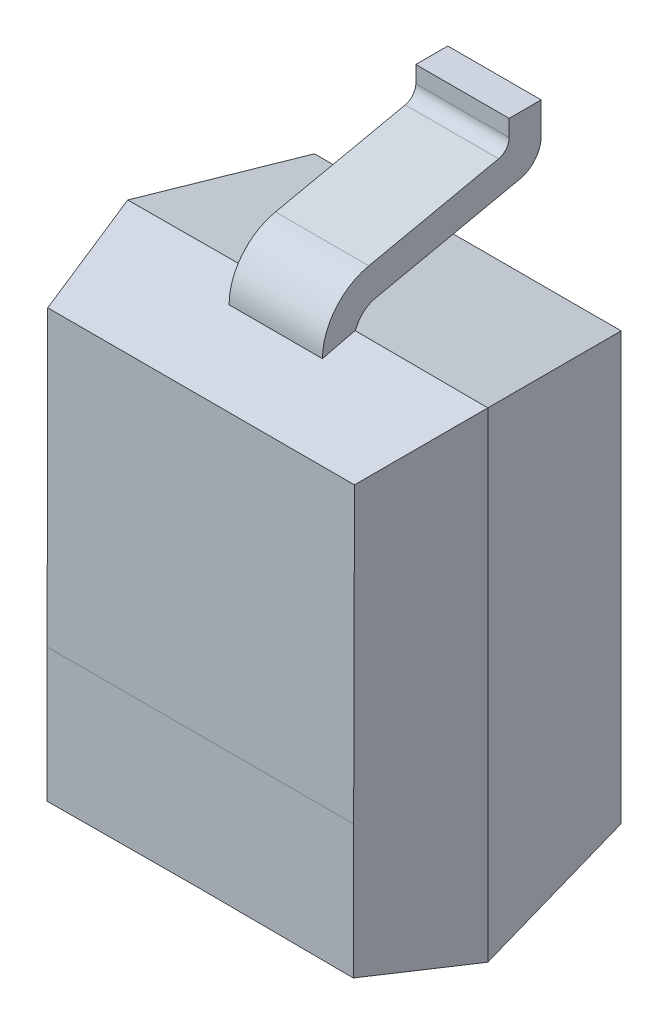
ISO-10303-21;
HEADER;
FILE_DESCRIPTION(('STEP AP214'),'2;1');
FILE_NAME('part.step','',(''),(''),'','','');
FILE_SCHEMA(('AUTOMOTIVE_DESIGN { 1 0 10303 214 1 1 1 1 }'));
ENDSEC;
DATA;
#1=APPLICATION_CONTEXT('core data for automotive mechanical design processes');
#2=APPLICATION_PROTOCOL_DEFINITION('international standard','automotive_design',2000,#1);
#3=PRODUCT_CONTEXT('',#1,'mechanical');
#4=PRODUCT('Part','Part','',(#3));
#5=PRODUCT_RELATED_PRODUCT_CATEGORY('part','',(#4));
#6=PRODUCT_DEFINITION_FORMATION('','',#4);
#7=PRODUCT_DEFINITION_CONTEXT('part definition',#1,'design');
#8=PRODUCT_DEFINITION('design','',#6,#7);
#9=PRODUCT_DEFINITION_SHAPE('','',#8);
#10=(LENGTH_UNIT() NAMED_UNIT(*) SI_UNIT(.MILLI.,.METRE.));
#11=(NAMED_UNIT(*) PLANE_ANGLE_UNIT() SI_UNIT($,.RADIAN.));
#12=(NAMED_UNIT(*) SI_UNIT($,.STERADIAN.) SOLID_ANGLE_UNIT());
#13=UNCERTAINTY_MEASURE_WITH_UNIT(LENGTH_MEASURE(1.E-05),#10,'distance_accuracy_value','');
#14=(GEOMETRIC_REPRESENTATION_CONTEXT(3) GLOBAL_UNCERTAINTY_ASSIGNED_CONTEXT((#13)) GLOBAL_UNIT_ASSIGNED_CONTEXT((#10,
#11,#12)) REPRESENTATION_CONTEXT('',''));
#15=CARTESIAN_POINT('',(0.,0.,0.));
#16=DIRECTION('',(0.,0.,1.));
#17=DIRECTION('',(1.,0.,0.));
#18=AXIS2_PLACEMENT_3D('',#15,#16,#17);
#19=CARTESIAN_POINT('',(59.103070808578,39.973934917196,0.6));
#20=DIRECTION('',(-1.,-4.371138828674E-08,0.));
#21=DIRECTION('',(0.,0.,1.));
#22=AXIS2_PLACEMENT_3D('',#19,#20,#21);
#23=CYLINDRICAL_SURFACE('',#22,0.09999999999807);
#24=CARTESIAN_POINT('',(59.103070812852,39.876154675796,0.620952908900103));
#25=DIRECTION('',(-0.999999999999999,-4.37114035443748E-08,0.));
#26=VECTOR('',#25,1.);
#27=LINE('',#24,#26);
#28=CARTESIAN_POINT('',(59.1030708128521,39.8761546759612,0.620952908860479));
#29=VERTEX_POINT('',#28);
#30=CARTESIAN_POINT('',(58.7530708128521,39.8761546606619,0.620952908859088));
#31=VERTEX_POINT('',#30);
#32=EDGE_CURVE('E1406',#29,#31,#27,.T.);
#33=ORIENTED_EDGE('',*,*,#32,.T.);
#34=CARTESIAN_POINT('',(58.7530708099094,39.943479005155,0.697685905259001));
#35=CARTESIAN_POINT('',(58.7530708109946,39.9186531098244,0.688033267951233));
#36=CARTESIAN_POINT('',(58.7530708118032,39.9001542227361,0.667374738457376));
#37=CARTESIAN_POINT('',(58.7530708126106,39.881681669388,0.646745617021661));
#38=CARTESIAN_POINT('',(58.7530708128522,39.876154660495,0.620952908892001));
#39=B_SPLINE_CURVE_WITH_KNOTS('',2,(#34,#35,#36,#37,#38),.UNSPECIFIED.,.F.,.F.,(3,2,3),(0.,0.5,
1.),.UNSPECIFIED.);
#40=CARTESIAN_POINT('',(58.7530708099084,39.9434920738784,0.697517092070688));
#41=VERTEX_POINT('',#40);
#42=EDGE_CURVE('E1246',#41,#31,#39,.T.);
#43=ORIENTED_EDGE('',*,*,#42,.F.);
#44=CARTESIAN_POINT('',(59.1030708098921,39.9438647031394,0.695371810407155));
#45=DIRECTION('',(-0.999999999999999,-4.37113837189628E-08,0.));
#46=VECTOR('',#45,1.);
#47=LINE('',#44,#46);
#48=CARTESIAN_POINT('',(59.1030708099085,39.9434920891776,0.697517092070596));
#49=VERTEX_POINT('',#48);
#50=EDGE_CURVE('E1010',#49,#41,#47,.T.);
#51=ORIENTED_EDGE('',*,*,#50,.F.);
#52=CARTESIAN_POINT('',(59.1030708085777,39.973934917196,0.6));
#53=DIRECTION('',(1.,4.371138828674E-08,0.));
#54=DIRECTION('',(1.30104260700772E-08,-0.29764324009944,0.954677171416132));
#55=AXIS2_PLACEMENT_3D('',#52,#53,#54);
#56=CIRCLE('',#55,0.09999999999807);
#57=EDGE_CURVE('E1357',#49,#29,#56,.T.);
#58=ORIENTED_EDGE('',*,*,#57,.T.);
#59=EDGE_LOOP('',(#33,#43,#51,#58));
#60=FACE_BOUND('',#59,.T.);
#61=ADVANCED_FACE('F18',(#60),#23,.F.);
#62=CARTESIAN_POINT('',(58.928070816558,39.791386013957,0.225365853517));
#63=DIRECTION('',(4.27411009897561E-08,-0.977802414084682,0.209529088696932));
#64=DIRECTION('',(-1.,-4.37113882867286E-08,0.));
#65=AXIS2_PLACEMENT_3D('',#62,#63,#64);
#66=PLANE('',#65);
#67=CARTESIAN_POINT('',(58.753070817928,39.760031984897,0.0790470911300936));
#68=DIRECTION('',(0.999999999999999,4.37113837189636E-08,0.));
#69=VECTOR('',#68,1.);
#70=LINE('',#67,#69);
#71=CARTESIAN_POINT('',(58.753070817928,39.7600319852406,0.0790470910711653));
#72=VERTEX_POINT('',#71);
#73=CARTESIAN_POINT('',(59.103070817928,39.7600320005397,0.0790470910711059));
#74=VERTEX_POINT('',#73);
#75=EDGE_CURVE('E1397',#72,#74,#70,.T.);
#76=ORIENTED_EDGE('',*,*,#75,.F.);
#77=CARTESIAN_POINT('',(58.7530708128522,39.8761546604952,0.620952908891953));
#78=DIRECTION('',(9.15880881797312E-09,-0.209529089358011,-0.977802413943023));
#79=VECTOR('',#78,1.);
#80=LINE('',#77,#79);
#81=EDGE_CURVE('E1300',#31,#72,#80,.T.);
#82=ORIENTED_EDGE('',*,*,#81,.F.);
#83=ORIENTED_EDGE('',*,*,#32,.F.);
#84=CARTESIAN_POINT('',(59.103070812852,39.8761546762929,0.620952908787305));
#85=DIRECTION('',(9.1588088179359E-09,-0.209529088696922,-0.977802414084685));
#86=VECTOR('',#85,1.);
#87=LINE('',#84,#86);
#88=EDGE_CURVE('E1349',#29,#74,#87,.T.);
#89=ORIENTED_EDGE('',*,*,#88,.T.);
#90=EDGE_LOOP('',(#76,#82,#83,#89));
#91=FACE_BOUND('',#90,.T.);
#92=ADVANCED_FACE('F1159',(#91),#66,.F.);
#93=CARTESIAN_POINT('',(59.103070822202,39.662251759196,0.1));
#94=DIRECTION('',(-1.,-4.371138828674E-08,0.));
#95=DIRECTION('',(0.,0.,1.));
#96=AXIS2_PLACEMENT_3D('',#93,#94,#95);
#97=CYLINDRICAL_SURFACE('',#96,0.09999999960066);
#98=CARTESIAN_POINT('',(58.7530708179281,39.760031985216,0.0790470910838002));
#99=CARTESIAN_POINT('',(58.7530708182358,39.7529920659357,0.0461941357108625));
#100=CARTESIAN_POINT('',(58.7530708194779,39.7245769351665,0.0229045349440198));
#101=CARTESIAN_POINT('',(58.7530708206994,39.6966316151853,3.51125768407622E-10));
#102=CARTESIAN_POINT('',(58.7530708222022,39.662251743897,1.996683119407E-10));
#103=B_SPLINE_CURVE_WITH_KNOTS('',2,(#98,#99,#100,#101,#102),.UNSPECIFIED.,.F.,.F.,(3,2,3),(0.,
0.5,1.),.UNSPECIFIED.);
#104=CARTESIAN_POINT('',(58.7530708222021,39.6622517438972,1.66391384810348E-10));
#105=VERTEX_POINT('',#104);
#106=EDGE_CURVE('E1291',#72,#105,#103,.T.);
#107=ORIENTED_EDGE('',*,*,#106,.F.);
#108=ORIENTED_EDGE('',*,*,#75,.T.);
#109=CARTESIAN_POINT('',(59.1030708222021,39.662251759196,0.1));
#110=DIRECTION('',(-1.,-4.371138828674E-08,0.));
#111=DIRECTION('',(-4.27410886169442E-08,0.977802413949935,-0.20952908932575));
#112=AXIS2_PLACEMENT_3D('',#109,#110,#111);
#113=CIRCLE('',#112,0.0999999996006628);
#114=CARTESIAN_POINT('',(59.1030708222021,39.6622517591961,1.66326298233998E-10));
#115=VERTEX_POINT('',#114);
#116=EDGE_CURVE('E1341',#74,#115,#113,.T.);
#117=ORIENTED_EDGE('',*,*,#116,.T.);
#118=CARTESIAN_POINT('',(58.753070822202,39.6622517438975,0.));
#119=DIRECTION('',(0.999999999999999,4.37113837189636E-08,0.));
#120=VECTOR('',#119,1.);
#121=LINE('',#118,#120);
#122=EDGE_CURVE('E1388',#105,#115,#121,.T.);
#123=ORIENTED_EDGE('',*,*,#122,.F.);
#124=EDGE_LOOP('',(#107,#108,#117,#123));
#125=FACE_BOUND('',#124,.T.);
#126=ADVANCED_FACE('F1146',(#125),#97,.T.);
#127=CARTESIAN_POINT('',(58.928070770586,40.843093330547,0.));
#128=DIRECTION('',(0.,0.,-1.));
#129=DIRECTION('',(0.,-1.,0.));
#130=AXIS2_PLACEMENT_3D('',#127,#128,#129);
#131=PLANE('',#130);
#132=CARTESIAN_POINT('',(58.7530708222022,39.662251743897,0.));
#133=DIRECTION('',(4.37113599009431E-08,-0.999999999999999,0.));
#134=VECTOR('',#133,1.);
#135=LINE('',#132,#134);
#136=CARTESIAN_POINT('',(58.7530708274109,39.5430933228972,0.));
#137=VERTEX_POINT('',#136);
#138=EDGE_CURVE('E1282',#105,#137,#135,.T.);
#139=ORIENTED_EDGE('',*,*,#138,.F.);
#140=ORIENTED_EDGE('',*,*,#122,.T.);
#141=CARTESIAN_POINT('',(59.1030708222022,39.662251759196,0.));
#142=DIRECTION('',(4.37113599009457E-08,-0.999999999999999,0.));
#143=VECTOR('',#142,1.);
#144=LINE('',#141,#143);
#145=CARTESIAN_POINT('',(59.1030708274109,39.5430933381963,0.));
#146=VERTEX_POINT('',#145);
#147=EDGE_CURVE('E1333',#115,#146,#144,.T.);
#148=ORIENTED_EDGE('',*,*,#147,.T.);
#149=CARTESIAN_POINT('',(59.103070827411,39.5430933381965,0.));
#150=DIRECTION('',(-0.999999999999999,-4.37113837189636E-08,0.));
#151=VECTOR('',#150,1.);
#152=LINE('',#149,#151);
#153=EDGE_CURVE('E1380',#146,#137,#152,.T.);
#154=ORIENTED_EDGE('',*,*,#153,.T.);
#155=EDGE_LOOP('',(#139,#140,#148,#154));
#156=FACE_BOUND('',#155,.T.);
#157=ADVANCED_FACE('F1133',(#156),#131,.T.);
#158=CARTESIAN_POINT('',(58.928070827411,39.543093330547,0.));
#159=DIRECTION('',(-4.371138828674E-08,1.,0.));
#160=DIRECTION('',(0.,0.,1.));
#161=AXIS2_PLACEMENT_3D('',#158,#159,#160);
#162=PLANE('',#161);
#163=CARTESIAN_POINT('',(58.753070827411,39.5430933228975,0.12));
#164=DIRECTION('',(0.999999999999999,4.37113837189636E-08,0.));
#165=VECTOR('',#164,1.);
#166=LINE('',#163,#165);
#167=CARTESIAN_POINT('',(58.7530708274109,39.5430933228972,0.12));
#168=VERTEX_POINT('',#167);
#169=CARTESIAN_POINT('',(59.1030708274109,39.5430933381963,0.12));
#170=VERTEX_POINT('',#169);
#171=EDGE_CURVE('E1372',#168,#170,#166,.T.);
#172=ORIENTED_EDGE('',*,*,#171,.F.);
#173=CARTESIAN_POINT('',(58.7530708274108,39.543093322897,0.));
#174=DIRECTION('',(0.,0.,1.));
#175=VECTOR('',#174,1.);
#176=LINE('',#173,#175);
#177=EDGE_CURVE('E1273',#137,#168,#176,.T.);
#178=ORIENTED_EDGE('',*,*,#177,.F.);
#179=ORIENTED_EDGE('',*,*,#153,.F.);
#180=CARTESIAN_POINT('',(59.103070827411,39.5430933381965,0.));
#181=DIRECTION('',(0.,0.,1.));
#182=VECTOR('',#181,1.);
#183=LINE('',#180,#182);
#184=EDGE_CURVE('E1325',#146,#170,#183,.T.);
#185=ORIENTED_EDGE('',*,*,#184,.T.);
#186=EDGE_LOOP('',(#172,#178,#179,#185));
#187=FACE_BOUND('',#186,.T.);
#188=ADVANCED_FACE('F1120',(#187),#162,.F.);
#189=CARTESIAN_POINT('',(58.928070770586,40.843093330547,0.12));
#190=DIRECTION('',(0.,0.,1.));
#191=DIRECTION('',(1.,0.,0.));
#192=AXIS2_PLACEMENT_3D('',#189,#190,#191);
#193=PLANE('',#192);
#194=CARTESIAN_POINT('',(58.7530708274108,39.543093322897,0.12));
#195=DIRECTION('',(-4.37112953067808E-08,0.999999999999999,0.));
#196=VECTOR('',#195,1.);
#197=LINE('',#194,#196);
#198=CARTESIAN_POINT('',(58.7530708246759,39.6056626388985,0.120000000260967));
#199=VERTEX_POINT('',#198);
#200=EDGE_CURVE('E1264',#168,#199,#197,.T.);
#201=ORIENTED_EDGE('',*,*,#200,.F.);
#202=ORIENTED_EDGE('',*,*,#171,.T.);
#203=CARTESIAN_POINT('',(59.1030708274108,39.543093338196,0.12));
#204=DIRECTION('',(-4.37112953081769E-08,0.999999999999999,0.));
#205=VECTOR('',#204,1.);
#206=LINE('',#203,#205);
#207=CARTESIAN_POINT('',(59.1030708246759,39.6056626541961,0.120000000260967));
#208=VERTEX_POINT('',#207);
#209=EDGE_CURVE('E1317',#170,#208,#206,.T.);
#210=ORIENTED_EDGE('',*,*,#209,.T.);
#211=CARTESIAN_POINT('',(59.103070824676,39.6056626541965,0.12));
#212=DIRECTION('',(-0.999999999999999,-4.37113837189636E-08,0.));
#213=VECTOR('',#212,1.);
#214=LINE('',#211,#213);
#215=EDGE_CURVE('E1238',#208,#199,#214,.T.);
#216=ORIENTED_EDGE('',*,*,#215,.T.);
#217=EDGE_LOOP('',(#201,#202,#210,#216));
#218=FACE_BOUND('',#217,.T.);
#219=ADVANCED_FACE('F1107',(#218),#193,.T.);
#220=CARTESIAN_POINT('',(59.103070770586,40.843093338196,0.));
#221=DIRECTION('',(-1.,-4.371138828674E-08,0.));
#222=DIRECTION('',(-4.371138828674E-08,1.,0.));
#223=AXIS2_PLACEMENT_3D('',#220,#221,#222);
#224=PLANE('',#223);
#225=CARTESIAN_POINT('',(59.103070822539,39.6545527750531,0.159523545444051));
#226=DIRECTION('',(-9.15881282704428E-09,0.209529088696931,0.977802414084683));
#227=VECTOR('',#226,1.);
#228=LINE('',#225,#227);
#229=CARTESIAN_POINT('',(59.1030708225389,39.654552774512,0.1595235455508));
#230=VERTEX_POINT('',#229);
#231=CARTESIAN_POINT('',(59.1030708179811,39.7588183863263,0.646096399471199));
#232=VERTEX_POINT('',#231);
#233=EDGE_CURVE('E1212',#230,#232,#228,.T.);
#234=ORIENTED_EDGE('',*,*,#233,.F.);
#235=CARTESIAN_POINT('',(59.1030708225388,39.654552774372,0.15952354559));
#236=CARTESIAN_POINT('',(59.1030708227083,39.6506731644229,0.142422516838159));
#237=CARTESIAN_POINT('',(59.1030708233137,39.6368252494975,0.13145226778));
#238=CARTESIAN_POINT('',(59.1030708239343,39.6226257272426,0.120203477151063));
#239=CARTESIAN_POINT('',(59.1030708246758,39.605662654196,0.120000000174));
#240=B_SPLINE_CURVE_WITH_KNOTS('',2,(#235,#236,#237,#238,#239),.UNSPECIFIED.,.F.,.F.,(3,2,3),
(0.,0.5,1.),.UNSPECIFIED.);
#241=EDGE_CURVE('E1221',#230,#208,#240,.T.);
#242=ORIENTED_EDGE('',*,*,#241,.T.);
#243=ORIENTED_EDGE('',*,*,#209,.F.);
#244=ORIENTED_EDGE('',*,*,#184,.F.);
#245=ORIENTED_EDGE('',*,*,#147,.F.);
#246=ORIENTED_EDGE('',*,*,#116,.F.);
#247=ORIENTED_EDGE('',*,*,#88,.F.);
#248=ORIENTED_EDGE('',*,*,#57,.F.);
#249=CARTESIAN_POINT('',(59.1030708086123,39.9731428424348,0.820198018658046));
#250=DIRECTION('',(1.06018879772251E-08,-0.242535625013064,-0.970142500151149));
#251=VECTOR('',#250,1.);
#252=LINE('',#249,#251);
#253=CARTESIAN_POINT('',(59.1030708086035,39.9733460841289,0.820118874715209));
#254=VERTEX_POINT('',#253);
#255=EDGE_CURVE('E1364',#254,#49,#252,.T.);
#256=ORIENTED_EDGE('',*,*,#255,.F.);
#257=CARTESIAN_POINT('',(59.103070808578,39.973934917196,0.6));
#258=DIRECTION('',(-1.,-4.371138828674E-08,0.));
#259=DIRECTION('',(4.27410947735813E-08,-0.977802414078672,0.209529088724977));
#260=AXIS2_PLACEMENT_3D('',#257,#258,#259);
#261=CIRCLE('',#260,0.219999999901003);
#262=EDGE_CURVE('E1309',#232,#254,#261,.T.);
#263=ORIENTED_EDGE('',*,*,#262,.F.);
#264=EDGE_LOOP('',(#234,#242,#243,#244,#245,#246,#247,#248,#256,#263));
#265=FACE_BOUND('',#264,.T.);
#266=ADVANCED_FACE('F1094',(#265),#224,.F.);
#267=CARTESIAN_POINT('',(59.103070808578,39.973934917196,0.6));
#268=DIRECTION('',(-1.,-4.371138828674E-08,0.));
#269=DIRECTION('',(0.,0.,1.));
#270=AXIS2_PLACEMENT_3D('',#267,#268,#269);
#271=CYLINDRICAL_SURFACE('',#270,0.219999999901);
#272=CARTESIAN_POINT('',(58.7530708179812,39.758818370873,0.646096399505001));
#273=CARTESIAN_POINT('',(58.7530708172731,39.775015897407,0.721684856481319));
#274=CARTESIAN_POINT('',(58.7530708146238,39.8356258420515,0.771086539274502));
#275=CARTESIAN_POINT('',(58.7530708120037,39.8955667705131,0.819942923347443));
#276=CARTESIAN_POINT('',(58.7530708085954,39.973538864521,0.820099009311002));
#277=B_SPLINE_CURVE_WITH_KNOTS('',2,(#272,#273,#274,#275,#276),.UNSPECIFIED.,.F.,.F.,(3,2,3),
(0.,0.5,1.),.UNSPECIFIED.);
#278=CARTESIAN_POINT('',(58.7530708179811,39.7588183710277,0.646096399471937));
#279=VERTEX_POINT('',#278);
#280=CARTESIAN_POINT('',(58.7530708086035,39.9733460688302,0.820118874714726));
#281=VERTEX_POINT('',#280);
#282=EDGE_CURVE('E1255',#279,#281,#277,.T.);
#283=ORIENTED_EDGE('',*,*,#282,.F.);
#284=CARTESIAN_POINT('',(59.103070817981,39.7588183866003,0.646096399413469));
#285=DIRECTION('',(-0.999999999999999,-4.37114035443748E-08,0.));
#286=VECTOR('',#285,1.);
#287=LINE('',#284,#286);
#288=EDGE_CURVE('E1203',#232,#279,#287,.T.);
#289=ORIENTED_EDGE('',*,*,#288,.F.);
#290=ORIENTED_EDGE('',*,*,#262,.T.);
#291=CARTESIAN_POINT('',(58.7530708086123,39.9731428271356,0.820198018657336));
#292=DIRECTION('',(0.999999999999999,4.37118991796528E-08,2.02838737869572E-12));
#293=VECTOR('',#292,1.);
#294=LINE('',#291,#293);
#295=EDGE_CURVE('E1045',#281,#254,#294,.T.);
#296=ORIENTED_EDGE('',*,*,#295,.F.);
#297=EDGE_LOOP('',(#283,#289,#290,#296));
#298=FACE_BOUND('',#297,.T.);
#299=ADVANCED_FACE('F1081',(#298),#271,.T.);
#300=CARTESIAN_POINT('',(58.753070770586,40.843093322897,0.));
#301=DIRECTION('',(-1.,-4.371138828674E-08,0.));
#302=DIRECTION('',(-4.371138828674E-08,1.,0.));
#303=AXIS2_PLACEMENT_3D('',#300,#301,#302);
#304=PLANE('',#303);
#305=CARTESIAN_POINT('',(58.7530708099487,39.9425715168107,0.69791277734506));
#306=DIRECTION('',(-1.06018879771845E-08,0.242535625013016,0.970142500151161));
#307=VECTOR('',#306,1.);
#308=LINE('',#305,#307);
#309=EDGE_CURVE('E1420',#41,#281,#308,.T.);
#310=ORIENTED_EDGE('',*,*,#309,.F.);
#311=ORIENTED_EDGE('',*,*,#42,.T.);
#312=ORIENTED_EDGE('',*,*,#81,.T.);
#313=ORIENTED_EDGE('',*,*,#106,.T.);
#314=ORIENTED_EDGE('',*,*,#138,.T.);
#315=ORIENTED_EDGE('',*,*,#177,.T.);
#316=ORIENTED_EDGE('',*,*,#200,.T.);
#317=CARTESIAN_POINT('',(58.7530708246758,39.605662638899,0.120000000174));
#318=CARTESIAN_POINT('',(58.7530708239343,39.6226257119443,0.120203477151066));
#319=CARTESIAN_POINT('',(58.7530708233137,39.6368252341989,0.131452267780125));
#320=CARTESIAN_POINT('',(58.7530708227083,39.650673149124,0.14242251683844));
#321=CARTESIAN_POINT('',(58.7530708225388,39.654552759074,0.159523545591));
#322=B_SPLINE_CURVE_WITH_KNOTS('',2,(#317,#318,#319,#320,#321),.UNSPECIFIED.,.F.,.F.,(3,2,3),
(0.,0.5,1.),.UNSPECIFIED.);
#323=CARTESIAN_POINT('',(58.7530708225389,39.6545527592133,0.159523545551539));
#324=VERTEX_POINT('',#323);
#325=EDGE_CURVE('E1230',#199,#324,#322,.T.);
#326=ORIENTED_EDGE('',*,*,#325,.T.);
#327=CARTESIAN_POINT('',(58.753070817981,39.7588183713013,0.646096399413229));
#328=DIRECTION('',(9.15881282704428E-09,-0.209529088696931,-0.977802414084683));
#329=VECTOR('',#328,1.);
#330=LINE('',#327,#329);
#331=EDGE_CURVE('E1194',#279,#324,#330,.T.);
#332=ORIENTED_EDGE('',*,*,#331,.F.);
#333=ORIENTED_EDGE('',*,*,#282,.T.);
#334=EDGE_LOOP('',(#310,#311,#312,#313,#314,#315,#316,#326,#332,#333));
#335=FACE_BOUND('',#334,.T.);
#336=ADVANCED_FACE('F1068',(#335),#304,.T.);
#337=CARTESIAN_POINT('',(59.103070824676,39.605662654196,0.17));
#338=DIRECTION('',(-1.,-4.371138828674E-08,0.));
#339=DIRECTION('',(0.,0.,1.));
#340=AXIS2_PLACEMENT_3D('',#337,#338,#339);
#341=CYLINDRICAL_SURFACE('',#340,0.0499999993041);
#342=CARTESIAN_POINT('',(58.753070822539,39.6545527597484,0.159523545417655));
#343=DIRECTION('',(0.999999999999999,4.37113837189636E-08,0.));
#344=VECTOR('',#343,1.);
#345=LINE('',#342,#344);
#346=EDGE_CURVE('E1017',#324,#230,#345,.T.);
#347=ORIENTED_EDGE('',*,*,#346,.F.);
#348=ORIENTED_EDGE('',*,*,#325,.F.);
#349=ORIENTED_EDGE('',*,*,#215,.F.);
#350=ORIENTED_EDGE('',*,*,#241,.F.);
#351=EDGE_LOOP('',(#347,#348,#349,#350));
#352=FACE_BOUND('',#351,.T.);
#353=ADVANCED_FACE('F1055',(#352),#341,.F.);
#354=CARTESIAN_POINT('',(58.928070821686,39.674049724268,0.25050934416));
#355=DIRECTION('',(4.27411009897561E-08,-0.977802414084682,0.209529088696932));
#356=DIRECTION('',(-1.,-4.37113882867286E-08,0.));
#357=AXIS2_PLACEMENT_3D('',#354,#355,#356);
#358=PLANE('',#357);
#359=ORIENTED_EDGE('',*,*,#331,.T.);
#360=ORIENTED_EDGE('',*,*,#346,.T.);
#361=ORIENTED_EDGE('',*,*,#233,.T.);
#362=ORIENTED_EDGE('',*,*,#288,.T.);
#363=EDGE_LOOP('',(#359,#360,#361,#362));
#364=FACE_BOUND('',#363,.T.);
#365=ADVANCED_FACE('F999',(#364),#358,.T.);
#366=CARTESIAN_POINT('',(58.928070803901,40.080931168395,-0.127027027025));
#367=DIRECTION('',(4.31166478083186E-08,-0.986393923832197,-0.164398987305033));
#368=DIRECTION('',(0.,0.164398987305033,-0.986393923832198));
#369=AXIS2_PLACEMENT_3D('',#366,#367,#368);
#370=PLANE('',#369);
#371=CARTESIAN_POINT('',(58.3530708055103,40.0430933054232,0.0999999999935698));
#372=DIRECTION('',(-0.162221414039518,-0.162221428221917,0.97332852678459));
#373=VECTOR('',#372,1.);
#374=LINE('',#371,#373);
#375=CARTESIAN_POINT('',(58.3530708055402,40.0430933054231,0.0999999999982075));
#376=VERTEX_POINT('',#375);
#377=CARTESIAN_POINT('',(58.2530708099025,39.9430933008137,0.700000000077969));
#378=VERTEX_POINT('',#377);
#379=EDGE_CURVE('E229',#376,#378,#374,.T.);
#380=ORIENTED_EDGE('',*,*,#379,.F.);
#381=CARTESIAN_POINT('',(58.353070805555,40.0430933054232,0.100000000002039));
#382=DIRECTION('',(0.999999999999999,4.37113871651881E-08,0.));
#383=VECTOR('',#382,1.);
#384=LINE('',#381,#383);
#385=CARTESIAN_POINT('',(59.5030708055994,40.0430933556872,0.0999999999977157));
#386=VERTEX_POINT('',#385);
#387=EDGE_CURVE('E980',#376,#386,#384,.T.);
#388=ORIENTED_EDGE('',*,*,#387,.T.);
#389=CARTESIAN_POINT('',(59.5030708055994,40.0430933556921,0.0999999999969107));
#390=DIRECTION('',(0.162221428221925,-0.162221414039503,0.973328526784591));
#391=VECTOR('',#390,1.);
#392=LINE('',#389,#391);
#393=CARTESIAN_POINT('',(59.6030708099659,39.9430933599252,0.700000000057382));
#394=VERTEX_POINT('',#393);
#395=EDGE_CURVE('E1025',#386,#394,#392,.T.);
#396=ORIENTED_EDGE('',*,*,#395,.T.);
#397=CARTESIAN_POINT('',(59.1030708099259,39.9430933377981,0.700000000099096));
#398=DIRECTION('',(0.999999999999999,4.37113817333501E-08,0.));
#399=VECTOR('',#398,1.);
#400=LINE('',#397,#399);
#401=EDGE_CURVE('E230',#49,#394,#400,.T.);
#402=ORIENTED_EDGE('',*,*,#401,.F.);
#403=ORIENTED_EDGE('',*,*,#50,.T.);
#404=CARTESIAN_POINT('',(58.253070809918,39.9430933006434,0.700000000099094));
#405=DIRECTION('',(0.999999999999999,4.37113956135231E-08,0.));
#406=VECTOR('',#405,1.);
#407=LINE('',#404,#406);
#408=EDGE_CURVE('E1016',#378,#41,#407,.T.);
#409=ORIENTED_EDGE('',*,*,#408,.F.);
#410=EDGE_LOOP('',(#380,#388,#396,#402,#403,#409));
#411=FACE_BOUND('',#410,.T.);
#412=ADVANCED_FACE('F993',(#411),#370,.T.);
#413=CARTESIAN_POINT('',(58.928070770586,40.843093330547,1.105));
#414=DIRECTION('',(0.,0.,1.));
#415=DIRECTION('',(1.,0.,0.));
#416=AXIS2_PLACEMENT_3D('',#413,#414,#415);
#417=PLANE('',#416);
#418=CARTESIAN_POINT('',(59.5030708055433,40.0436815905679,1.10235294128128));
#419=CARTESIAN_POINT('',(58.9280708056048,40.0427992124918,1.09882352951257));
#420=CARTESIAN_POINT('',(58.3530708055223,40.0436815402996,1.10235294128036));
#421=B_SPLINE_CURVE_WITH_KNOTS('',2,(#418,#419,#420),.UNSPECIFIED.,.F.,.F.,(3,3),(0.,1.),.UNSPECIFIED.);
#422=CARTESIAN_POINT('',(59.5024603914187,40.0433678089714,1.10367543771886));
#423=VERTEX_POINT('',#422);
#424=CARTESIAN_POINT('',(58.3532939342371,40.0433164338779,1.10359685374933));
#425=VERTEX_POINT('',#424);
#426=EDGE_CURVE('E201',#423,#425,#421,.T.);
#427=ORIENTED_EDGE('',*,*,#426,.F.);
#428=CARTESIAN_POINT('',(59.5018207837428,40.5430933556264,1.10499999999985));
#429=DIRECTION('',(4.37113817304772E-08,-0.999999999999999,0.));
#430=VECTOR('',#429,1.);
#431=LINE('',#428,#430);
#432=CARTESIAN_POINT('',(59.5026432196556,40.5430933556623,1.1025326922309));
#433=VERTEX_POINT('',#432);
#434=EDGE_CURVE('E423',#433,#423,#431,.T.);
#435=ORIENTED_EDGE('',*,*,#434,.F.);
#436=CARTESIAN_POINT('',(59.503070783713,40.543093355681,1.105));
#437=DIRECTION('',(-0.999999999999999,-4.37113026925715E-08,0.));
#438=VECTOR('',#437,1.);
#439=LINE('',#436,#438);
#440=CARTESIAN_POINT('',(58.3530973858807,40.5430933054141,1.10243444286339));
#441=VERTEX_POINT('',#440);
#442=EDGE_CURVE('E205',#433,#441,#439,.T.);
#443=ORIENTED_EDGE('',*,*,#442,.T.);
#444=CARTESIAN_POINT('',(58.353070783692,40.543093305413,1.105));
#445=DIRECTION('',(4.37120062249835E-08,-0.999999999999999,0.));
#446=VECTOR('',#445,1.);
#447=LINE('',#444,#446);
#448=EDGE_CURVE('E197',#441,#425,#447,.T.);
#449=ORIENTED_EDGE('',*,*,#448,.T.);
#450=EDGE_LOOP('',(#427,#435,#443,#449));
#451=FACE_BOUND('',#450,.T.);
#452=ADVANCED_FACE('F200',(#451),#417,.T.);
#453=CARTESIAN_POINT('',(58.928070814812,39.831328624271,0.252941176543));
#454=DIRECTION('',(4.24062755175868E-08,-0.970142500151155,0.242535625013038));
#455=DIRECTION('',(-1.,-4.37113882867512E-08,0.));
#456=AXIS2_PLACEMENT_3D('',#453,#454,#455);
#457=PLANE('',#456);
#458=CARTESIAN_POINT('',(59.5025152500161,40.0436489112121,1.102222222232));
#459=DIRECTION('',(0.235702270675734,-0.235702250092896,-0.942809041587663));
#460=VECTOR('',#459,1.);
#461=LINE('',#458,#460);
#462=EDGE_CURVE('E225',#423,#394,#461,.T.);
#463=ORIENTED_EDGE('',*,*,#462,.F.);
#464=ORIENTED_EDGE('',*,*,#426,.T.);
#465=CARTESIAN_POINT('',(58.3536263610864,40.0436488605849,1.10222222232443));
#466=DIRECTION('',(-0.235702250092903,-0.235702270675742,-0.94280904158766));
#467=VECTOR('',#466,1.);
#468=LINE('',#465,#467);
#469=EDGE_CURVE('E212',#425,#378,#468,.T.);
#470=ORIENTED_EDGE('',*,*,#469,.T.);
#471=ORIENTED_EDGE('',*,*,#408,.T.);
#472=ORIENTED_EDGE('',*,*,#309,.T.);
#473=ORIENTED_EDGE('',*,*,#295,.T.);
#474=ORIENTED_EDGE('',*,*,#255,.T.);
#475=ORIENTED_EDGE('',*,*,#401,.T.);
#476=EDGE_LOOP('',(#463,#464,#470,#471,#472,#473,#474,#475));
#477=FACE_BOUND('',#476,.T.);
#478=ADVANCED_FACE('F219',(#477),#457,.T.);
#479=CARTESIAN_POINT('',(58.384827527298,40.843093306801,-0.09054054054794));
#480=DIRECTION('',(-0.986393923832197,-4.31166478083186E-08,-0.164398987305033));
#481=DIRECTION('',(-0.164398987305033,0.,0.986393923832198));
#482=AXIS2_PLACEMENT_3D('',#479,#480,#481);
#483=PLANE('',#482);
#484=CARTESIAN_POINT('',(58.2530708098796,39.943093300746,0.70000000000556));
#485=DIRECTION('',(-4.37113886631982E-08,0.999999999999999,0.));
#486=VECTOR('',#485,1.);
#487=LINE('',#484,#486);
#488=CARTESIAN_POINT('',(58.2530707312229,41.7430933012442,0.700000000097189));
#489=VERTEX_POINT('',#488);
#490=EDGE_CURVE('E213',#378,#489,#487,.T.);
#491=ORIENTED_EDGE('',*,*,#490,.T.);
#492=CARTESIAN_POINT('',(58.3530707356174,41.6430933054026,0.100000000001619));
#493=DIRECTION('',(-0.162221428221919,0.162221414039509,0.973328526784591));
#494=VECTOR('',#493,1.);
#495=LINE('',#492,#494);
#496=CARTESIAN_POINT('',(58.3530707356021,41.6430933054039,0.0999999999983672));
#497=VERTEX_POINT('',#496);
#498=EDGE_CURVE('E409',#497,#489,#495,.T.);
#499=ORIENTED_EDGE('',*,*,#498,.F.);
#500=CARTESIAN_POINT('',(58.3530707355722,41.643093305406,0.0999999999925531));
#501=DIRECTION('',(4.37113886757803E-08,-0.999999999999999,0.));
#502=VECTOR('',#501,1.);
#503=LINE('',#500,#502);
#504=EDGE_CURVE('E958',#497,#376,#503,.T.);
#505=ORIENTED_EDGE('',*,*,#504,.T.);
#506=ORIENTED_EDGE('',*,*,#379,.T.);
#507=EDGE_LOOP('',(#491,#499,#505,#506));
#508=FACE_BOUND('',#507,.T.);
#509=ADVANCED_FACE('F1727',(#508),#483,.T.);
#510=CARTESIAN_POINT('',(59.471314013874,40.843093354293,-0.09054054054794));
#511=DIRECTION('',(-0.986393923832197,-4.31166478083186E-08,0.164398987305033));
#512=DIRECTION('',(-4.37113882867485E-08,1.,0.));
#513=AXIS2_PLACEMENT_3D('',#510,#511,#512);
#514=PLANE('',#513);
#515=CARTESIAN_POINT('',(59.5030708055998,40.043093355684,0.0999999999924876));
#516=DIRECTION('',(-4.371138867548E-08,0.999999999999999,0.));
#517=VECTOR('',#516,1.);
#518=LINE('',#515,#517);
#519=CARTESIAN_POINT('',(59.5030707356562,41.6430933556747,0.0999999999969376));
#520=VERTEX_POINT('',#519);
#521=EDGE_CURVE('E972',#386,#520,#518,.T.);
#522=ORIENTED_EDGE('',*,*,#521,.T.);
#523=CARTESIAN_POINT('',(59.6030707313002,41.7430933600508,0.70000000005617));
#524=DIRECTION('',(-0.162221414039915,-0.162221428221368,-0.973328526784616));
#525=VECTOR('',#524,1.);
#526=LINE('',#523,#525);
#527=CARTESIAN_POINT('',(59.6030707312867,41.7430933601926,0.700000000059679));
#528=VERTEX_POINT('',#527);
#529=EDGE_CURVE('E398',#528,#520,#526,.T.);
#530=ORIENTED_EDGE('',*,*,#529,.F.);
#531=CARTESIAN_POINT('',(59.6030708099572,39.943093359953,0.700000000008004));
#532=DIRECTION('',(-4.37113886692691E-08,0.999999999999999,0.));
#533=VECTOR('',#532,1.);
#534=LINE('',#531,#533);
#535=EDGE_CURVE('E909',#394,#528,#534,.T.);
#536=ORIENTED_EDGE('',*,*,#535,.F.);
#537=ORIENTED_EDGE('',*,*,#395,.F.);
#538=EDGE_LOOP('',(#522,#530,#536,#537));
#539=FACE_BOUND('',#538,.T.);
#540=ADVANCED_FACE('F1718',(#539),#514,.F.);
#541=CARTESIAN_POINT('',(58.928070770586,40.843093330547,0.1));
#542=DIRECTION('',(0.,0.,1.));
#543=DIRECTION('',(1.,0.,0.));
#544=AXIS2_PLACEMENT_3D('',#541,#542,#543);
#545=PLANE('',#544);
#546=CARTESIAN_POINT('',(59.503070735646,41.6430933556708,0.100000000002039));
#547=DIRECTION('',(-0.999999999999999,-4.37113871657589E-08,0.));
#548=VECTOR('',#547,1.);
#549=LINE('',#546,#548);
#550=EDGE_CURVE('E391',#520,#497,#549,.T.);
#551=ORIENTED_EDGE('',*,*,#550,.F.);
#552=ORIENTED_EDGE('',*,*,#521,.F.);
#553=ORIENTED_EDGE('',*,*,#387,.F.);
#554=ORIENTED_EDGE('',*,*,#504,.F.);
#555=EDGE_LOOP('',(#551,#552,#553,#554));
#556=FACE_BOUND('',#555,.T.);
#557=ADVANCED_FACE('F931',(#556),#545,.F.);
#558=CARTESIAN_POINT('',(59.72807077061,40.843093365516,0.199999999985));
#559=DIRECTION('',(0.970142500151155,4.24062755175868E-08,0.242535625013038));
#560=DIRECTION('',(0.,-0.999999999999985,1.74845553164845E-07));
#561=AXIS2_PLACEMENT_3D('',#558,#559,#560);
#562=PLANE('',#561);
#563=ORIENTED_EDGE('',*,*,#535,.T.);
#564=CARTESIAN_POINT('',(59.5030707356587,41.6430933560863,1.10000000010849));
#565=DIRECTION('',(0.235702250069968,0.235702270677088,-0.942809041593057));
#566=VECTOR('',#565,1.);
#567=LINE('',#564,#566);
#568=CARTESIAN_POINT('',(59.5030707356581,41.6430933558165,1.1000000000379));
#569=VERTEX_POINT('',#568);
#570=EDGE_CURVE('E385',#569,#528,#567,.T.);
#571=ORIENTED_EDGE('',*,*,#570,.F.);
#572=CARTESIAN_POINT('',(59.5030707356576,41.643093355681,1.10000000000994));
#573=DIRECTION('',(4.37113918293588E-08,-0.999999999999999,0.));
#574=VECTOR('',#573,1.);
#575=LINE('',#572,#574);
#576=EDGE_CURVE('E291',#569,#433,#575,.T.);
#577=ORIENTED_EDGE('',*,*,#576,.T.);
#578=ORIENTED_EDGE('',*,*,#434,.T.);
#579=ORIENTED_EDGE('',*,*,#462,.T.);
#580=EDGE_LOOP('',(#563,#571,#577,#578,#579));
#581=FACE_BOUND('',#580,.T.);
#582=ADVANCED_FACE('F258',(#581),#562,.T.);
#583=CARTESIAN_POINT('',(58.128070770562,40.843093295578,0.199999999985));
#584=DIRECTION('',(0.970142500151155,4.24062755175868E-08,-0.242535625013038));
#585=DIRECTION('',(0.,-0.999999999999985,-1.74845553164845E-07));
#586=AXIS2_PLACEMENT_3D('',#583,#584,#585);
#587=PLANE('',#586);
#588=ORIENTED_EDGE('',*,*,#448,.F.);
#589=CARTESIAN_POINT('',(58.3530707836588,40.543093305413,1.10000000001017));
#590=DIRECTION('',(-4.37113918239543E-08,0.999999999999999,0.));
#591=VECTOR('',#590,1.);
#592=LINE('',#589,#591);
#593=CARTESIAN_POINT('',(58.3530707356074,41.6430933056618,1.10000000005327));
#594=VERTEX_POINT('',#593);
#595=EDGE_CURVE('E283',#441,#594,#592,.T.);
#596=ORIENTED_EDGE('',*,*,#595,.T.);
#597=CARTESIAN_POINT('',(58.2530707312541,41.743093301431,0.700000000131736));
#598=DIRECTION('',(0.235702270697961,-0.235702250070037,0.942809041587822));
#599=VECTOR('',#598,1.);
#600=LINE('',#597,#599);
#601=EDGE_CURVE('E286',#489,#594,#600,.T.);
#602=ORIENTED_EDGE('',*,*,#601,.F.);
#603=ORIENTED_EDGE('',*,*,#490,.F.);
#604=ORIENTED_EDGE('',*,*,#469,.F.);
#605=EDGE_LOOP('',(#588,#596,#602,#603,#604));
#606=FACE_BOUND('',#605,.T.);
#607=ADVANCED_FACE('F234',(#606),#587,.F.);
#608=CARTESIAN_POINT('',(58.928070770586,40.843093330547,1.1));
#609=DIRECTION('',(0.,0.,-1.));
#610=DIRECTION('',(0.,-1.,0.));
#611=AXIS2_PLACEMENT_3D('',#608,#609,#610);
#612=PLANE('',#611);
#613=CARTESIAN_POINT('',(58.353070735617,41.6430933058199,1.10000000010173));
#614=DIRECTION('',(0.999999999999999,4.37113931991234E-08,0.));
#615=VECTOR('',#614,1.);
#616=LINE('',#613,#615);
#617=EDGE_CURVE('E294',#594,#569,#616,.T.);
#618=ORIENTED_EDGE('',*,*,#617,.F.);
#619=ORIENTED_EDGE('',*,*,#595,.F.);
#620=ORIENTED_EDGE('',*,*,#442,.F.);
#621=ORIENTED_EDGE('',*,*,#576,.F.);
#622=EDGE_LOOP('',(#618,#619,#620,#621));
#623=FACE_BOUND('',#622,.T.);
#624=ADVANCED_FACE('F257',(#623),#612,.F.);
#625=CARTESIAN_POINT('',(58.928070737271,41.605255492699,-0.127027027025));
#626=DIRECTION('',(-4.31166478083186E-08,0.986393923832197,-0.164398987305033));
#627=DIRECTION('',(-0.999999999999965,0.,2.62268329721014E-07));
#628=AXIS2_PLACEMENT_3D('',#625,#626,#627);
#629=PLANE('',#628);
#630=ORIENTED_EDGE('',*,*,#529,.T.);
#631=ORIENTED_EDGE('',*,*,#550,.T.);
#632=ORIENTED_EDGE('',*,*,#498,.T.);
#633=CARTESIAN_POINT('',(58.7530707312461,41.7430933232949,0.700000000098861));
#634=DIRECTION('',(-0.999999999999999,-4.37113956128862E-08,0.));
#635=VECTOR('',#634,1.);
#636=LINE('',#633,#635);
#637=CARTESIAN_POINT('',(58.7530707312636,41.7426945719135,0.697517092061846));
#638=VERTEX_POINT('',#637);
#639=EDGE_CURVE('E308',#638,#489,#636,.T.);
#640=ORIENTED_EDGE('',*,*,#639,.F.);
#641=CARTESIAN_POINT('',(58.7530707312799,41.7423219579546,0.695371810407154));
#642=DIRECTION('',(0.999999999999999,4.37113837189628E-08,0.));
#643=VECTOR('',#642,1.);
#644=LINE('',#641,#643);
#645=CARTESIAN_POINT('',(59.1030707312636,41.7426945872126,0.697517092061769));
#646=VERTEX_POINT('',#645);
#647=EDGE_CURVE('E301',#638,#646,#644,.T.);
#648=ORIENTED_EDGE('',*,*,#647,.T.);
#649=CARTESIAN_POINT('',(59.603070731282,41.7430933604496,0.700000000098861));
#650=DIRECTION('',(-0.999999999999999,-4.3711381733287E-08,0.));
#651=VECTOR('',#650,1.);
#652=LINE('',#649,#651);
#653=EDGE_CURVE('E379',#528,#646,#652,.T.);
#654=ORIENTED_EDGE('',*,*,#653,.F.);
#655=EDGE_LOOP('',(#630,#631,#632,#640,#648,#654));
#656=FACE_BOUND('',#655,.T.);
#657=ADVANCED_FACE('F328',(#656),#629,.T.);
#658=CARTESIAN_POINT('',(58.92807072636,41.854858036822,0.252941176543));
#659=DIRECTION('',(-4.24062755175868E-08,0.970142500151155,0.242535625013038));
#660=DIRECTION('',(0.999999999999985,0.,1.74845553164845E-07));
#661=AXIS2_PLACEMENT_3D('',#658,#659,#660);
#662=PLANE('',#661);
#663=ORIENTED_EDGE('',*,*,#601,.T.);
#664=ORIENTED_EDGE('',*,*,#617,.T.);
#665=ORIENTED_EDGE('',*,*,#570,.T.);
#666=ORIENTED_EDGE('',*,*,#653,.T.);
#667=CARTESIAN_POINT('',(59.1030707312233,41.743615144283,0.697912777342237));
#668=DIRECTION('',(1.06019430235586E-08,-0.242535625013054,0.970142500151152));
#669=VECTOR('',#668,1.);
#670=LINE('',#667,#669);
#671=CARTESIAN_POINT('',(59.1030707325685,41.7128405922655,0.820118874769736));
#672=VERTEX_POINT('',#671);
#673=EDGE_CURVE('E373',#646,#672,#670,.T.);
#674=ORIENTED_EDGE('',*,*,#673,.T.);
#675=CARTESIAN_POINT('',(58.753070732577,41.7126476024807,0.819999643854216));
#676=CARTESIAN_POINT('',(58.7676540659103,41.7126476031181,0.819999643854216));
#677=CARTESIAN_POINT('',(58.7822373992437,41.7126476037555,0.819999643854216));
#678=CARTESIAN_POINT('',(58.8114040659103,41.7126476050304,0.819999643854216));
#679=CARTESIAN_POINT('',(58.8259873992437,41.7126476056678,0.819999643854216));
#680=CARTESIAN_POINT('',(58.8551540659103,41.7126476069426,0.819999643854216));
#681=CARTESIAN_POINT('',(58.8697373992437,41.71264760758,0.819999643854216));
#682=CARTESIAN_POINT('',(58.8989040659103,41.7126476088549,0.819999643854216));
#683=CARTESIAN_POINT('',(58.9134873992437,41.7126476094923,0.819999643854216));
#684=CARTESIAN_POINT('',(58.9426540659103,41.7126476107671,0.819999643854217));
#685=CARTESIAN_POINT('',(58.9572373992437,41.7126476114045,0.819999643854217));
#686=CARTESIAN_POINT('',(58.9864040659103,41.7126476126794,0.819999643854217));
#687=CARTESIAN_POINT('',(59.0009873992437,41.7126476133168,0.819999643854217));
#688=CARTESIAN_POINT('',(59.0301540659103,41.7126476145916,0.819999643854217));
#689=CARTESIAN_POINT('',(59.0447373992437,41.712647615229,0.819999643854217));
#690=CARTESIAN_POINT('',(59.0739040659103,41.7126476165039,0.819999643854217));
#691=CARTESIAN_POINT('',(59.0884873992437,41.7126476171413,0.819999643854217));
#692=CARTESIAN_POINT('',(59.103070732577,41.7126476177787,0.819999643854217));
#693=B_SPLINE_CURVE_WITH_KNOTS('',3,(#675,#676,#677,#678,#679,#680,#681,#682,#683,#684,#685,
#686,#687,#688,#689,#690,#691,#692),.UNSPECIFIED.,.F.,.F.,(4,2,2,2,2,2,2,2,4),(0.,
0.0437500000000022,0.0874999999999974,0.13125,0.175000000000002,0.218750000000004,
0.262499999999999,0.306250000000001,0.350000000000003),.UNSPECIFIED.);
#694=CARTESIAN_POINT('',(58.7530707325685,41.7128405769668,0.820118874770225));
#695=VERTEX_POINT('',#694);
#696=EDGE_CURVE('E367',#695,#672,#693,.T.);
#697=ORIENTED_EDGE('',*,*,#696,.F.);
#698=CARTESIAN_POINT('',(58.7530707325597,41.7130438186505,0.820198018688869));
#699=DIRECTION('',(-1.06018879742266E-08,0.242535625013005,-0.970142500151164));
#700=VECTOR('',#699,1.);
#701=LINE('',#698,#700);
#702=EDGE_CURVE('E365',#695,#638,#701,.T.);
#703=ORIENTED_EDGE('',*,*,#702,.T.);
#704=ORIENTED_EDGE('',*,*,#639,.T.);
#705=EDGE_LOOP('',(#663,#664,#665,#666,#674,#697,#703,#704));
#706=FACE_BOUND('',#705,.T.);
#707=ADVANCED_FACE('F305',(#706),#662,.T.);
#708=CARTESIAN_POINT('',(59.103070732594,41.712251759196,0.6));
#709=DIRECTION('',(-1.,-4.371138828674E-08,0.));
#710=DIRECTION('',(0.,0.,1.));
#711=AXIS2_PLACEMENT_3D('',#708,#709,#710);
#712=CYLINDRICAL_SURFACE('',#711,0.09999999997497);
#713=CARTESIAN_POINT('',(59.10307072832,41.8100320000988,0.620952908793279));
#714=DIRECTION('',(-0.999999999999999,-4.37113837189636E-08,0.));
#715=VECTOR('',#714,1.);
#716=LINE('',#713,#715);
#717=CARTESIAN_POINT('',(59.1030707283199,41.8100320004222,0.620952908857187));
#718=VERTEX_POINT('',#717);
#719=CARTESIAN_POINT('',(58.7530707283199,41.8100319851229,0.620952908858578));
#720=VERTEX_POINT('',#719);
#721=EDGE_CURVE('E535',#718,#720,#716,.T.);
#722=ORIENTED_EDGE('',*,*,#721,.F.);
#723=CARTESIAN_POINT('',(59.1030707325941,41.712251759196,0.6));
#724=DIRECTION('',(1.,4.371138828674E-08,0.));
#725=DIRECTION('',(-4.27410884569615E-08,0.977802414035848,0.209529088924822));
#726=AXIS2_PLACEMENT_3D('',#723,#724,#725);
#727=CIRCLE('',#726,0.0999999999749694);
#728=EDGE_CURVE('E509',#718,#646,#727,.T.);
#729=ORIENTED_EDGE('',*,*,#728,.T.);
#730=ORIENTED_EDGE('',*,*,#647,.F.);
#731=CARTESIAN_POINT('',(58.7530707283198,41.810031985288,0.620952908892001));
#732=CARTESIAN_POINT('',(58.7530707285561,41.8046253349805,0.646183943583988));
#733=CARTESIAN_POINT('',(58.7530707293688,41.7860324230436,0.667374738445376));
#734=CARTESIAN_POINT('',(58.7530707301527,41.7680996521736,0.687813154444626));
#735=CARTESIAN_POINT('',(58.7530707312626,41.742707640638,0.697685905256001));
#736=B_SPLINE_CURVE_WITH_KNOTS('',2,(#731,#732,#733,#734,#735),.UNSPECIFIED.,.F.,.F.,(3,2,3),
(0.,0.5,1.),.UNSPECIFIED.);
#737=EDGE_CURVE('E505',#720,#638,#736,.T.);
#738=ORIENTED_EDGE('',*,*,#737,.F.);
#739=EDGE_LOOP('',(#722,#729,#730,#738));
#740=FACE_BOUND('',#739,.T.);
#741=ADVANCED_FACE('F327',(#740),#712,.F.);
#742=CARTESIAN_POINT('',(58.928070770586,40.843093330547,0.12));
#743=DIRECTION('',(0.,0.,1.));
#744=DIRECTION('',(1.,0.,0.));
#745=AXIS2_PLACEMENT_3D('',#742,#743,#744);
#746=PLANE('',#745);
#747=CARTESIAN_POINT('',(58.7530707164962,42.080524006897,0.12));
#748=DIRECTION('',(-4.37112953081769E-08,0.999999999999999,0.));
#749=VECTOR('',#748,1.);
#750=LINE('',#747,#749);
#751=CARTESIAN_POINT('',(58.7530707164961,42.0805240068972,0.12));
#752=VERTEX_POINT('',#751);
#753=CARTESIAN_POINT('',(58.7530707137611,42.1430933228972,0.12));
#754=VERTEX_POINT('',#753);
#755=EDGE_CURVE('E733',#752,#754,#750,.T.);
#756=ORIENTED_EDGE('',*,*,#755,.F.);
#757=CARTESIAN_POINT('',(58.753070716496,42.0805240068975,0.12));
#758=DIRECTION('',(0.999999999999999,4.37113837189636E-08,0.));
#759=VECTOR('',#758,1.);
#760=LINE('',#757,#759);
#761=CARTESIAN_POINT('',(59.1030707164961,42.0805240221955,0.12));
#762=VERTEX_POINT('',#761);
#763=EDGE_CURVE('E685',#752,#762,#760,.T.);
#764=ORIENTED_EDGE('',*,*,#763,.T.);
#765=CARTESIAN_POINT('',(59.1030707164962,42.080524022195,0.12));
#766=DIRECTION('',(-4.37112953074789E-08,0.999999999999999,0.));
#767=VECTOR('',#766,1.);
#768=LINE('',#765,#767);
#769=CARTESIAN_POINT('',(59.1030707137611,42.1430933381963,0.12));
#770=VERTEX_POINT('',#769);
#771=EDGE_CURVE('E665',#762,#770,#768,.T.);
#772=ORIENTED_EDGE('',*,*,#771,.T.);
#773=CARTESIAN_POINT('',(58.753070713761,42.1430933228975,0.12));
#774=DIRECTION('',(0.999999999999999,4.37113837189636E-08,0.));
#775=VECTOR('',#774,1.);
#776=LINE('',#773,#775);
#777=EDGE_CURVE('E512',#754,#770,#776,.T.);
#778=ORIENTED_EDGE('',*,*,#777,.F.);
#779=EDGE_LOOP('',(#756,#764,#772,#778));
#780=FACE_BOUND('',#779,.T.);
#781=ADVANCED_FACE('F1664',(#780),#746,.T.);
#782=CARTESIAN_POINT('',(58.928070713761,42.143093330547,0.));
#783=DIRECTION('',(-4.371138828674E-08,1.,0.));
#784=DIRECTION('',(0.,0.,1.));
#785=AXIS2_PLACEMENT_3D('',#782,#783,#784);
#786=PLANE('',#785);
#787=CARTESIAN_POINT('',(58.7530707137612,42.143093322897,0.12));
#788=DIRECTION('',(0.,0.,-1.));
#789=VECTOR('',#788,1.);
#790=LINE('',#787,#789);
#791=CARTESIAN_POINT('',(58.7530707137611,42.1430933228972,0.));
#792=VERTEX_POINT('',#791);
#793=EDGE_CURVE('E726',#754,#792,#790,.T.);
#794=ORIENTED_EDGE('',*,*,#793,.F.);
#795=ORIENTED_EDGE('',*,*,#777,.T.);
#796=CARTESIAN_POINT('',(59.103070713761,42.1430933381965,0.12));
#797=DIRECTION('',(0.,0.,-1.));
#798=VECTOR('',#797,1.);
#799=LINE('',#796,#798);
#800=CARTESIAN_POINT('',(59.1030707137611,42.1430933381963,0.));
#801=VERTEX_POINT('',#800);
#802=EDGE_CURVE('E657',#770,#801,#799,.T.);
#803=ORIENTED_EDGE('',*,*,#802,.T.);
#804=CARTESIAN_POINT('',(58.753070713761,42.1430933228975,0.));
#805=DIRECTION('',(0.999999999999999,4.37113837189636E-08,0.));
#806=VECTOR('',#805,1.);
#807=LINE('',#804,#806);
#808=EDGE_CURVE('E774',#792,#801,#807,.T.);
#809=ORIENTED_EDGE('',*,*,#808,.F.);
#810=EDGE_LOOP('',(#794,#795,#803,#809));
#811=FACE_BOUND('',#810,.T.);
#812=ADVANCED_FACE('F1651',(#811),#786,.T.);
#813=CARTESIAN_POINT('',(58.928070770586,40.843093330547,0.));
#814=DIRECTION('',(0.,0.,-1.));
#815=DIRECTION('',(0.,-1.,0.));
#816=AXIS2_PLACEMENT_3D('',#813,#814,#815);
#817=PLANE('',#816);
#818=CARTESIAN_POINT('',(58.7530707137612,42.143093322897,0.));
#819=DIRECTION('',(4.37113599009457E-08,-0.999999999999999,0.));
#820=VECTOR('',#819,1.);
#821=LINE('',#818,#820);
#822=CARTESIAN_POINT('',(58.7530707189699,42.0239349018971,0.));
#823=VERTEX_POINT('',#822);
#824=EDGE_CURVE('E719',#792,#823,#821,.T.);
#825=ORIENTED_EDGE('',*,*,#824,.F.);
#826=ORIENTED_EDGE('',*,*,#808,.T.);
#827=CARTESIAN_POINT('',(59.1030707137612,42.143093338196,0.));
#828=DIRECTION('',(4.37113599009457E-08,-0.999999999999999,0.));
#829=VECTOR('',#828,1.);
#830=LINE('',#827,#829);
#831=CARTESIAN_POINT('',(59.1030707189699,42.0239349171961,0.));
#832=VERTEX_POINT('',#831);
#833=EDGE_CURVE('E647',#801,#832,#830,.T.);
#834=ORIENTED_EDGE('',*,*,#833,.T.);
#835=CARTESIAN_POINT('',(58.75307071897,42.0239349018975,0.));
#836=DIRECTION('',(0.999999999999999,4.37113837189636E-08,0.));
#837=VECTOR('',#836,1.);
#838=LINE('',#835,#837);
#839=EDGE_CURVE('E558',#823,#832,#838,.T.);
#840=ORIENTED_EDGE('',*,*,#839,.F.);
#841=EDGE_LOOP('',(#825,#826,#834,#840));
#842=FACE_BOUND('',#841,.T.);
#843=ADVANCED_FACE('F1641',(#842),#817,.T.);
#844=CARTESIAN_POINT('',(59.10307071897,42.023934917196,0.1));
#845=DIRECTION('',(-1.,-4.371138828674E-08,0.));
#846=DIRECTION('',(0.,0.,1.));
#847=AXIS2_PLACEMENT_3D('',#844,#845,#846);
#848=CYLINDRICAL_SURFACE('',#847,0.1);
#849=CARTESIAN_POINT('',(58.7530707189698,42.023934901897,-3.90519458133901E-13));
#850=CARTESIAN_POINT('',(58.7530707204384,41.990336134845,-3.90519458133901E-13));
#851=CARTESIAN_POINT('',(58.7530707216941,41.9616097104159,0.0229045346688925));
#852=CARTESIAN_POINT('',(58.753070722929,41.9333582436608,0.045430369770513));
#853=CARTESIAN_POINT('',(58.7530707232439,41.926154660481,0.0790470910628002));
#854=B_SPLINE_CURVE_WITH_KNOTS('',2,(#849,#850,#851,#852,#853),.UNSPECIFIED.,.F.,.F.,(3,2,3),
(0.,0.5,1.),.UNSPECIFIED.);
#855=CARTESIAN_POINT('',(58.753070723244,41.9261546604074,0.0790470910396727));
#856=VERTEX_POINT('',#855);
#857=EDGE_CURVE('E713',#823,#856,#854,.T.);
#858=ORIENTED_EDGE('',*,*,#857,.F.);
#859=ORIENTED_EDGE('',*,*,#839,.T.);
#860=CARTESIAN_POINT('',(59.10307071897,42.023934917196,0.1));
#861=DIRECTION('',(-1.,-4.371138828674E-08,0.));
#862=DIRECTION('',(0.,0.,-1.));
#863=AXIS2_PLACEMENT_3D('',#860,#861,#862);
#864=CIRCLE('',#863,0.1);
#865=CARTESIAN_POINT('',(59.103070723244,41.9261546757066,0.0790470910396222));
#866=VERTEX_POINT('',#865);
#867=EDGE_CURVE('E569',#832,#866,#864,.T.);
#868=ORIENTED_EDGE('',*,*,#867,.T.);
#869=CARTESIAN_POINT('',(58.753070723244,41.9261546600334,0.0790470909448216));
#870=DIRECTION('',(0.999999999999999,4.37113837189636E-08,0.));
#871=VECTOR('',#870,1.);
#872=LINE('',#869,#871);
#873=EDGE_CURVE('E557',#856,#866,#872,.T.);
#874=ORIENTED_EDGE('',*,*,#873,.F.);
#875=EDGE_LOOP('',(#858,#859,#868,#874));
#876=FACE_BOUND('',#875,.T.);
#877=ADVANCED_FACE('F1548',(#876),#848,.T.);
#878=CARTESIAN_POINT('',(58.928070724614,41.894800647137,0.225365853517));
#879=DIRECTION('',(4.27411009897561E-08,-0.977802414084682,-0.209529088696932));
#880=DIRECTION('',(0.,0.209529088696932,-0.977802414084683));
#881=AXIS2_PLACEMENT_3D('',#878,#879,#880);
#882=PLANE('',#881);
#883=CARTESIAN_POINT('',(58.7530707232439,41.9261546608925,0.0790470911509703));
#884=DIRECTION('',(9.15880881793155E-09,-0.209529089358011,0.977802413943023));
#885=VECTOR('',#884,1.);
#886=LINE('',#883,#885);
#887=EDGE_CURVE('E708',#856,#720,#886,.T.);
#888=ORIENTED_EDGE('',*,*,#887,.F.);
#889=ORIENTED_EDGE('',*,*,#873,.T.);
#890=CARTESIAN_POINT('',(59.103070723244,41.9261546753279,0.0790470909657804));
#891=DIRECTION('',(9.15880881796521E-09,-0.209529088696929,0.977802414084683));
#892=VECTOR('',#891,1.);
#893=LINE('',#890,#892);
#894=EDGE_CURVE('E561',#866,#718,#893,.T.);
#895=ORIENTED_EDGE('',*,*,#894,.T.);
#896=ORIENTED_EDGE('',*,*,#721,.T.);
#897=EDGE_LOOP('',(#888,#889,#895,#896));
#898=FACE_BOUND('',#897,.T.);
#899=ADVANCED_FACE('F563',(#898),#882,.T.);
#900=CARTESIAN_POINT('',(59.103070732594,41.712251759196,0.6));
#901=DIRECTION('',(-1.,-4.371138828674E-08,0.));
#902=DIRECTION('',(0.,0.,1.));
#903=AXIS2_PLACEMENT_3D('',#900,#901,#902);
#904=CYLINDRICAL_SURFACE('',#903,0.22);
#905=CARTESIAN_POINT('',(58.7530707325766,41.712647781275,0.820099009345002));
#906=CARTESIAN_POINT('',(58.7530707291577,41.790862136227,0.819385322374413));
#907=CARTESIAN_POINT('',(58.7530707265482,41.850560803813,0.771086539350002));
#908=CARTESIAN_POINT('',(58.7530707239334,41.9103794373581,0.722690698718413));
#909=CARTESIAN_POINT('',(58.7530707231908,41.927368274971,0.646096399514001));
#910=B_SPLINE_CURVE_WITH_KNOTS('',2,(#905,#906,#907,#908,#909),.UNSPECIFIED.,.F.,.F.,(3,2,3),
(0.,0.5,1.),.UNSPECIFIED.);
#911=CARTESIAN_POINT('',(58.7530707231909,41.9273682748072,0.646096399479542));
#912=VERTEX_POINT('',#911);
#913=EDGE_CURVE('E696',#695,#912,#910,.T.);
#914=ORIENTED_EDGE('',*,*,#913,.F.);
#915=ORIENTED_EDGE('',*,*,#696,.T.);
#916=CARTESIAN_POINT('',(59.1030707325943,41.712251759196,0.6));
#917=DIRECTION('',(-1.,-4.371138828674E-08,0.));
#918=DIRECTION('',(-7.86618245288392E-11,0.00179935719408295,0.999998381155534));
#919=AXIS2_PLACEMENT_3D('',#916,#917,#918);
#920=CIRCLE('',#919,0.22);
#921=CARTESIAN_POINT('',(59.1030707231909,41.9273682901058,0.646096399480281));
#922=VERTEX_POINT('',#921);
#923=EDGE_CURVE('E679',#672,#922,#920,.T.);
#924=ORIENTED_EDGE('',*,*,#923,.T.);
#925=CARTESIAN_POINT('',(59.103070723191,41.927368290293,0.646096399520897));
#926=DIRECTION('',(-0.999999999999999,-4.37113837189636E-08,0.));
#927=VECTOR('',#926,1.);
#928=LINE('',#925,#927);
#929=EDGE_CURVE('E577',#922,#912,#928,.T.);
#930=ORIENTED_EDGE('',*,*,#929,.T.);
#931=EDGE_LOOP('',(#914,#915,#924,#930));
#932=FACE_BOUND('',#931,.T.);
#933=ADVANCED_FACE('F1505',(#932),#904,.T.);
#934=CARTESIAN_POINT('',(58.753070770586,40.843093322897,0.));
#935=DIRECTION('',(-1.,-4.371138828674E-08,0.));
#936=DIRECTION('',(-4.371138828674E-08,1.,0.));
#937=AXIS2_PLACEMENT_3D('',#934,#935,#936);
#938=PLANE('',#937);
#939=ORIENTED_EDGE('',*,*,#702,.F.);
#940=ORIENTED_EDGE('',*,*,#913,.T.);
#941=CARTESIAN_POINT('',(58.7530707231908,41.9273682748976,0.646096399498271));
#942=DIRECTION('',(-9.15881282705067E-09,0.209529089595055,-0.977802413892228));
#943=VECTOR('',#942,1.);
#944=LINE('',#941,#943);
#945=CARTESIAN_POINT('',(58.7530707186331,42.0316338862976,0.159523545489871));
#946=VERTEX_POINT('',#945);
#947=EDGE_CURVE('E1609',#912,#946,#944,.T.);
#948=ORIENTED_EDGE('',*,*,#947,.T.);
#949=CARTESIAN_POINT('',(58.7530707186332,42.031633886381,0.159523545517));
#950=CARTESIAN_POINT('',(58.7530707184692,42.035387103478,0.142979645788154));
#951=CARTESIAN_POINT('',(58.7530707178583,42.0493614112046,0.131452267317875));
#952=CARTESIAN_POINT('',(58.7530707172626,42.0629896882847,0.120210328835249));
#953=CARTESIAN_POINT('',(58.7530707164962,42.080524006897,0.12));
#954=B_SPLINE_CURVE_WITH_KNOTS('',2,(#949,#950,#951,#952,#953),.UNSPECIFIED.,.F.,.F.,(3,2,3),
(0.,0.5,1.),.UNSPECIFIED.);
#955=EDGE_CURVE('E691',#946,#752,#954,.T.);
#956=ORIENTED_EDGE('',*,*,#955,.T.);
#957=ORIENTED_EDGE('',*,*,#755,.T.);
#958=ORIENTED_EDGE('',*,*,#793,.T.);
#959=ORIENTED_EDGE('',*,*,#824,.T.);
#960=ORIENTED_EDGE('',*,*,#857,.T.);
#961=ORIENTED_EDGE('',*,*,#887,.T.);
#962=ORIENTED_EDGE('',*,*,#737,.T.);
#963=EDGE_LOOP('',(#939,#940,#948,#956,#957,#958,#959,#960,#961,#962));
#964=FACE_BOUND('',#963,.T.);
#965=ADVANCED_FACE('F1488',(#964),#938,.T.);
#966=CARTESIAN_POINT('',(59.103070716496,42.080524022196,0.17));
#967=DIRECTION('',(-1.,-4.371138828674E-08,0.));
#968=DIRECTION('',(0.,0.,1.));
#969=AXIS2_PLACEMENT_3D('',#966,#967,#968);
#970=CYLINDRICAL_SURFACE('',#969,0.05);
#971=ORIENTED_EDGE('',*,*,#763,.F.);
#972=ORIENTED_EDGE('',*,*,#955,.F.);
#973=CARTESIAN_POINT('',(58.753070718633,42.0316338862166,0.159523545454019));
#974=DIRECTION('',(0.999999999999999,4.37113837189636E-08,0.));
#975=VECTOR('',#974,1.);
#976=LINE('',#973,#975);
#977=CARTESIAN_POINT('',(59.1030707186332,42.0316339015965,0.159523545490507));
#978=VERTEX_POINT('',#977);
#979=EDGE_CURVE('E30',#946,#978,#976,.T.);
#980=ORIENTED_EDGE('',*,*,#979,.T.);
#981=CARTESIAN_POINT('',(59.1030707164959,42.080524022196,0.17));
#982=DIRECTION('',(1.,4.371138828674E-08,0.));
#983=DIRECTION('',(4.27410884462617E-08,-0.977802413726188,-0.209529090369901));
#984=AXIS2_PLACEMENT_3D('',#981,#982,#983);
#985=CIRCLE('',#984,0.0500000000000016);
#986=EDGE_CURVE('E672',#978,#762,#985,.T.);
#987=ORIENTED_EDGE('',*,*,#986,.T.);
#988=EDGE_LOOP('',(#971,#972,#980,#987));
#989=FACE_BOUND('',#988,.T.);
#990=ADVANCED_FACE('F596',(#989),#970,.F.);
#991=CARTESIAN_POINT('',(59.103070770586,40.843093338196,0.));
#992=DIRECTION('',(-1.,-4.371138828674E-08,0.));
#993=DIRECTION('',(-4.371138828674E-08,1.,0.));
#994=AXIS2_PLACEMENT_3D('',#991,#992,#993);
#995=PLANE('',#994);
#996=ORIENTED_EDGE('',*,*,#894,.F.);
#997=ORIENTED_EDGE('',*,*,#867,.F.);
#998=ORIENTED_EDGE('',*,*,#833,.F.);
#999=ORIENTED_EDGE('',*,*,#802,.F.);
#1000=ORIENTED_EDGE('',*,*,#771,.F.);
#1001=ORIENTED_EDGE('',*,*,#986,.F.);
#1002=CARTESIAN_POINT('',(59.1030707186332,42.0316339021899,0.159523545627271));
#1003=DIRECTION('',(9.15881282704683E-09,-0.209529089595051,0.977802413892229));
#1004=VECTOR('',#1003,1.);
#1005=LINE('',#1002,#1004);
#1006=EDGE_CURVE('E11',#978,#922,#1005,.T.);
#1007=ORIENTED_EDGE('',*,*,#1006,.T.);
#1008=ORIENTED_EDGE('',*,*,#923,.F.);
#1009=ORIENTED_EDGE('',*,*,#673,.F.);
#1010=ORIENTED_EDGE('',*,*,#728,.F.);
#1011=EDGE_LOOP('',(#996,#997,#998,#999,#1000,#1001,#1007,#1008,#1009,#1010));
#1012=FACE_BOUND('',#1011,.T.);
#1013=ADVANCED_FACE('F573',(#1012),#995,.F.);
#1014=CARTESIAN_POINT('',(58.928070719485,42.012136936825,0.25050934416));
#1015=DIRECTION('',(4.27411009897561E-08,-0.977802414084682,-0.209529088696932));
#1016=DIRECTION('',(0.,0.209529088696932,-0.977802414084683));
#1017=AXIS2_PLACEMENT_3D('',#1014,#1015,#1016);
#1018=PLANE('',#1017);
#1019=ORIENTED_EDGE('',*,*,#979,.F.);
#1020=ORIENTED_EDGE('',*,*,#947,.F.);
#1021=ORIENTED_EDGE('',*,*,#929,.F.);
#1022=ORIENTED_EDGE('',*,*,#1006,.F.);
#1023=EDGE_LOOP('',(#1019,#1020,#1021,#1022));
#1024=FACE_BOUND('',#1023,.T.);
#1025=ADVANCED_FACE('F595',(#1024),#1018,.F.);
#1026=CLOSED_SHELL('',(#61,#92,#126,#157,#188,#219,#266,#299,#336,#353,#365,#412,#452,#478,#509,
#540,#557,#582,#607,#624,#657,#707,#741,#781,#812,#843,#877,#899,#933,#965,#990,#1013,#1025));
#1027=MANIFOLD_SOLID_BREP('B1',#1026);
#1028=ADVANCED_BREP_SHAPE_REPRESENTATION('',(#18,#1027),#14);
#1029=SHAPE_DEFINITION_REPRESENTATION(#9,#1028);
ENDSEC;
END-ISO-10303-21;
